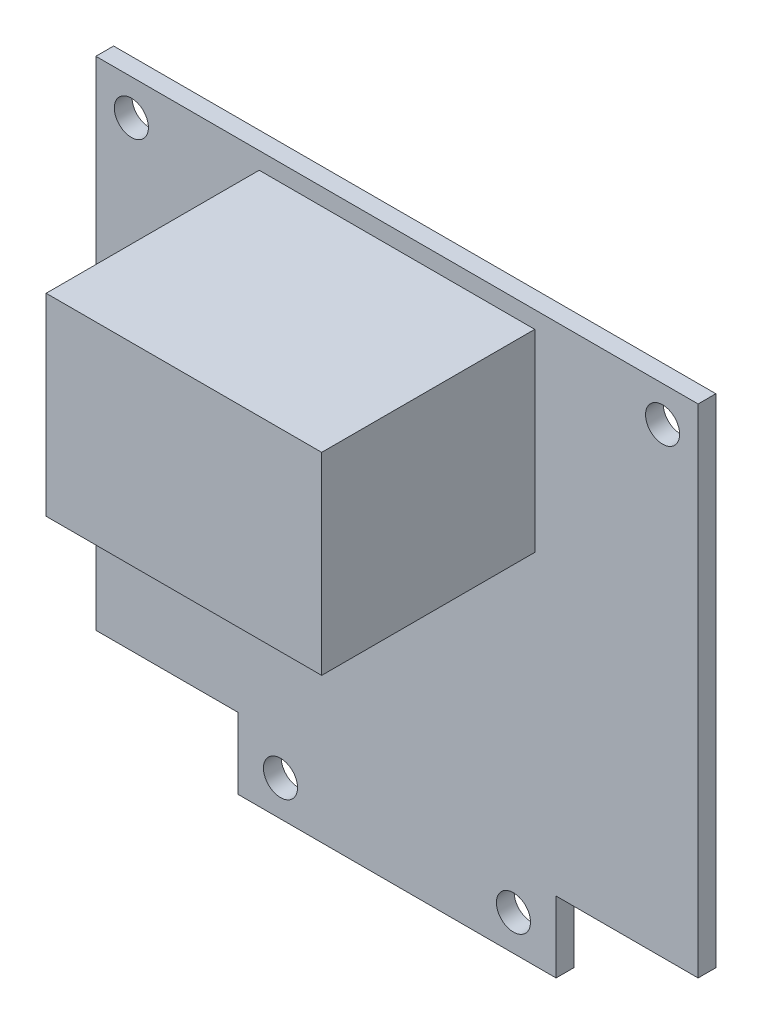
ISO-10303-21;
HEADER;
FILE_DESCRIPTION(('STEP AP214'),'2;1');
FILE_NAME('part.step','',(''),(''),'','','');
FILE_SCHEMA(('AUTOMOTIVE_DESIGN { 1 0 10303 214 1 1 1 1 }'));
ENDSEC;
DATA;
#1=APPLICATION_CONTEXT('core data for automotive mechanical design processes');
#2=APPLICATION_PROTOCOL_DEFINITION('international standard','automotive_design',2000,#1);
#3=PRODUCT_CONTEXT('',#1,'mechanical');
#4=PRODUCT('Part','Part','',(#3));
#5=PRODUCT_RELATED_PRODUCT_CATEGORY('part','',(#4));
#6=PRODUCT_DEFINITION_FORMATION('','',#4);
#7=PRODUCT_DEFINITION_CONTEXT('part definition',#1,'design');
#8=PRODUCT_DEFINITION('design','',#6,#7);
#9=PRODUCT_DEFINITION_SHAPE('','',#8);
#10=(LENGTH_UNIT() NAMED_UNIT(*) SI_UNIT(.MILLI.,.METRE.));
#11=(NAMED_UNIT(*) PLANE_ANGLE_UNIT() SI_UNIT($,.RADIAN.));
#12=(NAMED_UNIT(*) SI_UNIT($,.STERADIAN.) SOLID_ANGLE_UNIT());
#13=UNCERTAINTY_MEASURE_WITH_UNIT(LENGTH_MEASURE(1.E-05),#10,'distance_accuracy_value','');
#14=(GEOMETRIC_REPRESENTATION_CONTEXT(3) GLOBAL_UNCERTAINTY_ASSIGNED_CONTEXT((#13)) GLOBAL_UNIT_ASSIGNED_CONTEXT((#10,
#11,#12)) REPRESENTATION_CONTEXT('',''));
#15=CARTESIAN_POINT('',(0.,0.,0.));
#16=DIRECTION('',(0.,0.,1.));
#17=DIRECTION('',(1.,0.,0.));
#18=AXIS2_PLACEMENT_3D('',#15,#16,#17);
#19=CARTESIAN_POINT('',(0.,0.,1.5875));
#20=DIRECTION('',(0.,0.,1.));
#21=DIRECTION('',(1.,0.,0.));
#22=AXIS2_PLACEMENT_3D('',#19,#20,#21);
#23=PLANE('',#22);
#24=CARTESIAN_POINT('',(-10.414,-22.225,1.5875));
#25=DIRECTION('',(0.,0.,1.));
#26=DIRECTION('',(1.,0.,0.));
#27=AXIS2_PLACEMENT_3D('',#24,#25,#26);
#28=CIRCLE('',#27,1.524);
#29=CARTESIAN_POINT('',(-8.89,-22.225,1.5875));
#30=VERTEX_POINT('',#29);
#31=EDGE_CURVE('E181',#30,#30,#28,.T.);
#32=ORIENTED_EDGE('',*,*,#31,.F.);
#33=EDGE_LOOP('',(#32));
#34=FACE_BOUND('',#33,.T.);
#35=CARTESIAN_POINT('',(10.414,-22.225,1.5875));
#36=DIRECTION('',(0.,0.,1.));
#37=DIRECTION('',(1.,0.,0.));
#38=AXIS2_PLACEMENT_3D('',#35,#36,#37);
#39=CIRCLE('',#38,1.524);
#40=CARTESIAN_POINT('',(11.938,-22.225,1.5875));
#41=VERTEX_POINT('',#40);
#42=EDGE_CURVE('E394',#41,#41,#39,.T.);
#43=ORIENTED_EDGE('',*,*,#42,.F.);
#44=EDGE_LOOP('',(#43));
#45=FACE_BOUND('',#44,.T.);
#46=CARTESIAN_POINT('',(23.749,22.225,1.5875));
#47=DIRECTION('',(0.,0.,1.));
#48=DIRECTION('',(1.,0.,0.));
#49=AXIS2_PLACEMENT_3D('',#46,#47,#48);
#50=CIRCLE('',#49,1.524);
#51=CARTESIAN_POINT('',(25.273,22.225,1.5875));
#52=VERTEX_POINT('',#51);
#53=EDGE_CURVE('E397',#52,#52,#50,.T.);
#54=ORIENTED_EDGE('',*,*,#53,.F.);
#55=EDGE_LOOP('',(#54));
#56=FACE_BOUND('',#55,.T.);
#57=CARTESIAN_POINT('',(-23.749,22.225,1.5875));
#58=DIRECTION('',(0.,0.,1.));
#59=DIRECTION('',(1.,0.,0.));
#60=AXIS2_PLACEMENT_3D('',#57,#58,#59);
#61=CIRCLE('',#60,1.524);
#62=CARTESIAN_POINT('',(-22.225,22.225,1.5875));
#63=VERTEX_POINT('',#62);
#64=EDGE_CURVE('E400',#63,#63,#61,.T.);
#65=ORIENTED_EDGE('',*,*,#64,.F.);
#66=EDGE_LOOP('',(#65));
#67=FACE_BOUND('',#66,.T.);
#68=DIRECTION('',(0.,-1.,0.));
#69=VECTOR('',#68,1.);
#70=CARTESIAN_POINT('',(14.224,0.,1.5875));
#71=LINE('',#70,#69);
#72=CARTESIAN_POINT('',(14.224,-19.05,1.5875));
#73=VERTEX_POINT('',#72);
#74=CARTESIAN_POINT('',(14.224,-25.4,1.5875));
#75=VERTEX_POINT('',#74);
#76=EDGE_CURVE('E402',#73,#75,#71,.T.);
#77=ORIENTED_EDGE('',*,*,#76,.F.);
#78=DIRECTION('',(-1.,0.,0.));
#79=VECTOR('',#78,1.);
#80=CARTESIAN_POINT('',(0.,-19.05,1.5875));
#81=LINE('',#80,#79);
#82=CARTESIAN_POINT('',(26.924,-19.05,1.5875));
#83=VERTEX_POINT('',#82);
#84=EDGE_CURVE('E404',#83,#73,#81,.T.);
#85=ORIENTED_EDGE('',*,*,#84,.F.);
#86=DIRECTION('',(0.,1.,0.));
#87=VECTOR('',#86,1.);
#88=CARTESIAN_POINT('',(26.924,0.,1.5875));
#89=LINE('',#88,#87);
#90=CARTESIAN_POINT('',(26.924,25.4,1.5875));
#91=VERTEX_POINT('',#90);
#92=EDGE_CURVE('E153',#83,#91,#89,.T.);
#93=ORIENTED_EDGE('',*,*,#92,.T.);
#94=DIRECTION('',(1.,0.,0.));
#95=VECTOR('',#94,1.);
#96=CARTESIAN_POINT('',(0.,25.4,1.5875));
#97=LINE('',#96,#95);
#98=CARTESIAN_POINT('',(-26.924,25.4,1.5875));
#99=VERTEX_POINT('',#98);
#100=EDGE_CURVE('E407',#99,#91,#97,.T.);
#101=ORIENTED_EDGE('',*,*,#100,.F.);
#102=DIRECTION('',(0.,1.,0.));
#103=VECTOR('',#102,1.);
#104=CARTESIAN_POINT('',(-26.924,0.,1.5875));
#105=LINE('',#104,#103);
#106=CARTESIAN_POINT('',(-26.924,-19.05,1.5875));
#107=VERTEX_POINT('',#106);
#108=EDGE_CURVE('E130',#107,#99,#105,.T.);
#109=ORIENTED_EDGE('',*,*,#108,.F.);
#110=DIRECTION('',(1.,0.,0.));
#111=VECTOR('',#110,1.);
#112=CARTESIAN_POINT('',(0.,-19.05,1.5875));
#113=LINE('',#112,#111);
#114=CARTESIAN_POINT('',(-14.224,-19.05,1.5875));
#115=VERTEX_POINT('',#114);
#116=EDGE_CURVE('E123',#107,#115,#113,.T.);
#117=ORIENTED_EDGE('',*,*,#116,.T.);
#118=DIRECTION('',(0.,-1.,0.));
#119=VECTOR('',#118,1.);
#120=CARTESIAN_POINT('',(-14.224,0.,1.5875));
#121=LINE('',#120,#119);
#122=CARTESIAN_POINT('',(-14.224,-25.4,1.5875));
#123=VERTEX_POINT('',#122);
#124=EDGE_CURVE('E114',#115,#123,#121,.T.);
#125=ORIENTED_EDGE('',*,*,#124,.T.);
#126=DIRECTION('',(1.,0.,0.));
#127=VECTOR('',#126,1.);
#128=CARTESIAN_POINT('',(0.,-25.4,1.5875));
#129=LINE('',#128,#127);
#130=EDGE_CURVE('E59',#123,#75,#129,.T.);
#131=ORIENTED_EDGE('',*,*,#130,.T.);
#132=EDGE_LOOP('',(#77,#85,#93,#101,#109,#117,#125,#131));
#133=FACE_BOUND('',#132,.T.);
#134=DIRECTION('',(1.,0.,0.));
#135=VECTOR('',#134,1.);
#136=CARTESIAN_POINT('',(-12.319,6.604,1.5875));
#137=LINE('',#136,#135);
#138=CARTESIAN_POINT('',(-12.319,6.604,1.5875));
#139=VERTEX_POINT('',#138);
#140=CARTESIAN_POINT('',(12.319,6.604,1.5875));
#141=VERTEX_POINT('',#140);
#142=EDGE_CURVE('E430',#139,#141,#137,.T.);
#143=ORIENTED_EDGE('',*,*,#142,.F.);
#144=DIRECTION('',(0.,-1.,0.));
#145=VECTOR('',#144,1.);
#146=CARTESIAN_POINT('',(-12.319,23.876,1.5875));
#147=LINE('',#146,#145);
#148=CARTESIAN_POINT('',(-12.319,23.876,1.5875));
#149=VERTEX_POINT('',#148);
#150=EDGE_CURVE('E383',#149,#139,#147,.T.);
#151=ORIENTED_EDGE('',*,*,#150,.F.);
#152=DIRECTION('',(-1.,0.,0.));
#153=VECTOR('',#152,1.);
#154=CARTESIAN_POINT('',(-12.319,23.876,1.5875));
#155=LINE('',#154,#153);
#156=CARTESIAN_POINT('',(12.319,23.876,1.5875));
#157=VERTEX_POINT('',#156);
#158=EDGE_CURVE('E377',#157,#149,#155,.T.);
#159=ORIENTED_EDGE('',*,*,#158,.F.);
#160=DIRECTION('',(0.,1.,0.));
#161=VECTOR('',#160,1.);
#162=CARTESIAN_POINT('',(12.319,23.876,1.5875));
#163=LINE('',#162,#161);
#164=EDGE_CURVE('E428',#141,#157,#163,.T.);
#165=ORIENTED_EDGE('',*,*,#164,.F.);
#166=EDGE_LOOP('',(#143,#151,#159,#165));
#167=FACE_BOUND('',#166,.T.);
#168=ADVANCED_FACE('F35',(#34,#45,#56,#67,#133,#167),#23,.T.);
#169=CARTESIAN_POINT('',(14.224,0.,1.5875));
#170=DIRECTION('',(1.,0.,0.));
#171=DIRECTION('',(0.,0.,-1.));
#172=AXIS2_PLACEMENT_3D('',#169,#170,#171);
#173=PLANE('',#172);
#174=DIRECTION('',(0.,-1.,0.));
#175=VECTOR('',#174,1.);
#176=CARTESIAN_POINT('',(14.224,0.,0.));
#177=LINE('',#176,#175);
#178=CARTESIAN_POINT('',(14.224,-19.05,0.));
#179=VERTEX_POINT('',#178);
#180=CARTESIAN_POINT('',(14.224,-25.4,0.));
#181=VERTEX_POINT('',#180);
#182=EDGE_CURVE('E168',#179,#181,#177,.T.);
#183=ORIENTED_EDGE('',*,*,#182,.F.);
#184=DIRECTION('',(0.,0.,-1.));
#185=VECTOR('',#184,1.);
#186=CARTESIAN_POINT('',(14.224,-19.05,1.5875));
#187=LINE('',#186,#185);
#188=EDGE_CURVE('E11',#73,#179,#187,.T.);
#189=ORIENTED_EDGE('',*,*,#188,.F.);
#190=ORIENTED_EDGE('',*,*,#76,.T.);
#191=DIRECTION('',(0.,0.,-1.));
#192=VECTOR('',#191,1.);
#193=CARTESIAN_POINT('',(14.224,-25.4,1.5875));
#194=LINE('',#193,#192);
#195=EDGE_CURVE('E91',#75,#181,#194,.T.);
#196=ORIENTED_EDGE('',*,*,#195,.T.);
#197=EDGE_LOOP('',(#183,#189,#190,#196));
#198=FACE_BOUND('',#197,.T.);
#199=ADVANCED_FACE('F213',(#198),#173,.T.);
#200=CARTESIAN_POINT('',(0.,-19.05,1.5875));
#201=DIRECTION('',(0.,-1.,0.));
#202=DIRECTION('',(0.,0.,-1.));
#203=AXIS2_PLACEMENT_3D('',#200,#201,#202);
#204=PLANE('',#203);
#205=DIRECTION('',(-1.,0.,0.));
#206=VECTOR('',#205,1.);
#207=CARTESIAN_POINT('',(0.,-19.05,0.));
#208=LINE('',#207,#206);
#209=CARTESIAN_POINT('',(26.924,-19.05,0.));
#210=VERTEX_POINT('',#209);
#211=EDGE_CURVE('E162',#210,#179,#208,.T.);
#212=ORIENTED_EDGE('',*,*,#211,.F.);
#213=DIRECTION('',(0.,0.,-1.));
#214=VECTOR('',#213,1.);
#215=CARTESIAN_POINT('',(26.924,-19.05,1.5875));
#216=LINE('',#215,#214);
#217=EDGE_CURVE('E43',#83,#210,#216,.T.);
#218=ORIENTED_EDGE('',*,*,#217,.F.);
#219=ORIENTED_EDGE('',*,*,#84,.T.);
#220=ORIENTED_EDGE('',*,*,#188,.T.);
#221=EDGE_LOOP('',(#212,#218,#219,#220));
#222=FACE_BOUND('',#221,.T.);
#223=ADVANCED_FACE('F167',(#222),#204,.T.);
#224=CARTESIAN_POINT('',(26.924,0.,1.5875));
#225=DIRECTION('',(-1.,0.,0.));
#226=DIRECTION('',(0.,0.,1.));
#227=AXIS2_PLACEMENT_3D('',#224,#225,#226);
#228=PLANE('',#227);
#229=DIRECTION('',(0.,1.,0.));
#230=VECTOR('',#229,1.);
#231=CARTESIAN_POINT('',(26.924,0.,0.));
#232=LINE('',#231,#230);
#233=CARTESIAN_POINT('',(26.924,25.4,0.));
#234=VERTEX_POINT('',#233);
#235=EDGE_CURVE('E151',#210,#234,#232,.T.);
#236=ORIENTED_EDGE('',*,*,#235,.T.);
#237=DIRECTION('',(0.,0.,-1.));
#238=VECTOR('',#237,1.);
#239=CARTESIAN_POINT('',(26.924,25.4,1.5875));
#240=LINE('',#239,#238);
#241=EDGE_CURVE('E144',#91,#234,#240,.T.);
#242=ORIENTED_EDGE('',*,*,#241,.F.);
#243=ORIENTED_EDGE('',*,*,#92,.F.);
#244=ORIENTED_EDGE('',*,*,#217,.T.);
#245=EDGE_LOOP('',(#236,#242,#243,#244));
#246=FACE_BOUND('',#245,.T.);
#247=ADVANCED_FACE('F149',(#246),#228,.F.);
#248=CARTESIAN_POINT('',(0.,25.4,1.5875));
#249=DIRECTION('',(0.,1.,0.));
#250=DIRECTION('',(0.,0.,1.));
#251=AXIS2_PLACEMENT_3D('',#248,#249,#250);
#252=PLANE('',#251);
#253=DIRECTION('',(1.,0.,0.));
#254=VECTOR('',#253,1.);
#255=CARTESIAN_POINT('',(0.,25.4,0.));
#256=LINE('',#255,#254);
#257=CARTESIAN_POINT('',(-26.924,25.4,0.));
#258=VERTEX_POINT('',#257);
#259=EDGE_CURVE('E165',#258,#234,#256,.T.);
#260=ORIENTED_EDGE('',*,*,#259,.F.);
#261=DIRECTION('',(0.,0.,-1.));
#262=VECTOR('',#261,1.);
#263=CARTESIAN_POINT('',(-26.924,25.4,1.5875));
#264=LINE('',#263,#262);
#265=EDGE_CURVE('E138',#99,#258,#264,.T.);
#266=ORIENTED_EDGE('',*,*,#265,.F.);
#267=ORIENTED_EDGE('',*,*,#100,.T.);
#268=ORIENTED_EDGE('',*,*,#241,.T.);
#269=EDGE_LOOP('',(#260,#266,#267,#268));
#270=FACE_BOUND('',#269,.T.);
#271=ADVANCED_FACE('F237',(#270),#252,.T.);
#272=CARTESIAN_POINT('',(-26.924,0.,1.5875));
#273=DIRECTION('',(-1.,0.,0.));
#274=DIRECTION('',(0.,0.,1.));
#275=AXIS2_PLACEMENT_3D('',#272,#273,#274);
#276=PLANE('',#275);
#277=DIRECTION('',(0.,1.,0.));
#278=VECTOR('',#277,1.);
#279=CARTESIAN_POINT('',(-26.924,0.,0.));
#280=LINE('',#279,#278);
#281=CARTESIAN_POINT('',(-26.924,-19.05,0.));
#282=VERTEX_POINT('',#281);
#283=EDGE_CURVE('E175',#282,#258,#280,.T.);
#284=ORIENTED_EDGE('',*,*,#283,.F.);
#285=DIRECTION('',(0.,0.,-1.));
#286=VECTOR('',#285,1.);
#287=CARTESIAN_POINT('',(-26.924,-19.05,1.5875));
#288=LINE('',#287,#286);
#289=EDGE_CURVE('E136',#107,#282,#288,.T.);
#290=ORIENTED_EDGE('',*,*,#289,.F.);
#291=ORIENTED_EDGE('',*,*,#108,.T.);
#292=ORIENTED_EDGE('',*,*,#265,.T.);
#293=EDGE_LOOP('',(#284,#290,#291,#292));
#294=FACE_BOUND('',#293,.T.);
#295=ADVANCED_FACE('F234',(#294),#276,.T.);
#296=CARTESIAN_POINT('',(0.,-19.05,1.5875));
#297=DIRECTION('',(0.,1.,0.));
#298=DIRECTION('',(0.,0.,1.));
#299=AXIS2_PLACEMENT_3D('',#296,#297,#298);
#300=PLANE('',#299);
#301=DIRECTION('',(1.,0.,0.));
#302=VECTOR('',#301,1.);
#303=CARTESIAN_POINT('',(0.,-19.05,0.));
#304=LINE('',#303,#302);
#305=CARTESIAN_POINT('',(-14.224,-19.05,0.));
#306=VERTEX_POINT('',#305);
#307=EDGE_CURVE('E135',#282,#306,#304,.T.);
#308=ORIENTED_EDGE('',*,*,#307,.T.);
#309=DIRECTION('',(0.,0.,-1.));
#310=VECTOR('',#309,1.);
#311=CARTESIAN_POINT('',(-14.224,-19.05,1.5875));
#312=LINE('',#311,#310);
#313=EDGE_CURVE('E119',#115,#306,#312,.T.);
#314=ORIENTED_EDGE('',*,*,#313,.F.);
#315=ORIENTED_EDGE('',*,*,#116,.F.);
#316=ORIENTED_EDGE('',*,*,#289,.T.);
#317=EDGE_LOOP('',(#308,#314,#315,#316));
#318=FACE_BOUND('',#317,.T.);
#319=ADVANCED_FACE('F133',(#318),#300,.F.);
#320=CARTESIAN_POINT('',(-14.224,0.,1.5875));
#321=DIRECTION('',(1.,0.,0.));
#322=DIRECTION('',(0.,0.,-1.));
#323=AXIS2_PLACEMENT_3D('',#320,#321,#322);
#324=PLANE('',#323);
#325=DIRECTION('',(0.,-1.,0.));
#326=VECTOR('',#325,1.);
#327=CARTESIAN_POINT('',(-14.224,0.,0.));
#328=LINE('',#327,#326);
#329=CARTESIAN_POINT('',(-14.224,-25.4,0.));
#330=VERTEX_POINT('',#329);
#331=EDGE_CURVE('E178',#306,#330,#328,.T.);
#332=ORIENTED_EDGE('',*,*,#331,.T.);
#333=DIRECTION('',(0.,0.,-1.));
#334=VECTOR('',#333,1.);
#335=CARTESIAN_POINT('',(-14.224,-25.4,1.5875));
#336=LINE('',#335,#334);
#337=EDGE_CURVE('E122',#123,#330,#336,.T.);
#338=ORIENTED_EDGE('',*,*,#337,.F.);
#339=ORIENTED_EDGE('',*,*,#124,.F.);
#340=ORIENTED_EDGE('',*,*,#313,.T.);
#341=EDGE_LOOP('',(#332,#338,#339,#340));
#342=FACE_BOUND('',#341,.T.);
#343=ADVANCED_FACE('F117',(#342),#324,.F.);
#344=CARTESIAN_POINT('',(-23.749,22.225,1.5875));
#345=DIRECTION('',(0.,0.,-1.));
#346=DIRECTION('',(-1.,0.,0.));
#347=AXIS2_PLACEMENT_3D('',#344,#345,#346);
#348=CYLINDRICAL_SURFACE('',#347,1.524);
#349=ORIENTED_EDGE('',*,*,#64,.T.);
#350=EDGE_LOOP('',(#349));
#351=FACE_BOUND('',#350,.T.);
#352=CARTESIAN_POINT('',(-23.749,22.225,0.));
#353=DIRECTION('',(0.,0.,1.));
#354=DIRECTION('',(1.,0.,0.));
#355=AXIS2_PLACEMENT_3D('',#352,#353,#354);
#356=CIRCLE('',#355,1.524);
#357=CARTESIAN_POINT('',(-22.225,22.225,0.));
#358=VERTEX_POINT('',#357);
#359=EDGE_CURVE('E170',#358,#358,#356,.T.);
#360=ORIENTED_EDGE('',*,*,#359,.F.);
#361=EDGE_LOOP('',(#360));
#362=FACE_BOUND('',#361,.T.);
#363=ADVANCED_FACE('F197',(#351,#362),#348,.F.);
#364=CARTESIAN_POINT('',(23.749,22.225,1.5875));
#365=DIRECTION('',(0.,0.,-1.));
#366=DIRECTION('',(-1.,0.,0.));
#367=AXIS2_PLACEMENT_3D('',#364,#365,#366);
#368=CYLINDRICAL_SURFACE('',#367,1.524);
#369=ORIENTED_EDGE('',*,*,#53,.T.);
#370=EDGE_LOOP('',(#369));
#371=FACE_BOUND('',#370,.T.);
#372=CARTESIAN_POINT('',(23.749,22.225,0.));
#373=DIRECTION('',(0.,0.,1.));
#374=DIRECTION('',(1.,0.,0.));
#375=AXIS2_PLACEMENT_3D('',#372,#373,#374);
#376=CIRCLE('',#375,1.524);
#377=CARTESIAN_POINT('',(25.273,22.225,0.));
#378=VERTEX_POINT('',#377);
#379=EDGE_CURVE('E191',#378,#378,#376,.T.);
#380=ORIENTED_EDGE('',*,*,#379,.F.);
#381=EDGE_LOOP('',(#380));
#382=FACE_BOUND('',#381,.T.);
#383=ADVANCED_FACE('F199',(#371,#382),#368,.F.);
#384=CARTESIAN_POINT('',(10.414,-22.225,1.5875));
#385=DIRECTION('',(0.,0.,-1.));
#386=DIRECTION('',(-1.,0.,0.));
#387=AXIS2_PLACEMENT_3D('',#384,#385,#386);
#388=CYLINDRICAL_SURFACE('',#387,1.524);
#389=ORIENTED_EDGE('',*,*,#42,.T.);
#390=EDGE_LOOP('',(#389));
#391=FACE_BOUND('',#390,.T.);
#392=CARTESIAN_POINT('',(10.414,-22.225,0.));
#393=DIRECTION('',(0.,0.,1.));
#394=DIRECTION('',(1.,0.,0.));
#395=AXIS2_PLACEMENT_3D('',#392,#393,#394);
#396=CIRCLE('',#395,1.524);
#397=CARTESIAN_POINT('',(11.938,-22.225,0.));
#398=VERTEX_POINT('',#397);
#399=EDGE_CURVE('E187',#398,#398,#396,.T.);
#400=ORIENTED_EDGE('',*,*,#399,.F.);
#401=EDGE_LOOP('',(#400));
#402=FACE_BOUND('',#401,.T.);
#403=ADVANCED_FACE('F206',(#391,#402),#388,.F.);
#404=CARTESIAN_POINT('',(-10.414,-22.225,1.5875));
#405=DIRECTION('',(0.,0.,-1.));
#406=DIRECTION('',(-1.,0.,0.));
#407=AXIS2_PLACEMENT_3D('',#404,#405,#406);
#408=CYLINDRICAL_SURFACE('',#407,1.524);
#409=ORIENTED_EDGE('',*,*,#31,.T.);
#410=EDGE_LOOP('',(#409));
#411=FACE_BOUND('',#410,.T.);
#412=CARTESIAN_POINT('',(-10.414,-22.225,0.));
#413=DIRECTION('',(0.,0.,1.));
#414=DIRECTION('',(1.,0.,0.));
#415=AXIS2_PLACEMENT_3D('',#412,#413,#414);
#416=CIRCLE('',#415,1.524);
#417=CARTESIAN_POINT('',(-8.89,-22.225,0.));
#418=VERTEX_POINT('',#417);
#419=EDGE_CURVE('E184',#418,#418,#416,.T.);
#420=ORIENTED_EDGE('',*,*,#419,.F.);
#421=EDGE_LOOP('',(#420));
#422=FACE_BOUND('',#421,.T.);
#423=ADVANCED_FACE('F37',(#411,#422),#408,.F.);
#424=CARTESIAN_POINT('',(0.,-25.4,1.5875));
#425=DIRECTION('',(0.,1.,0.));
#426=DIRECTION('',(0.,0.,1.));
#427=AXIS2_PLACEMENT_3D('',#424,#425,#426);
#428=PLANE('',#427);
#429=DIRECTION('',(1.,0.,0.));
#430=VECTOR('',#429,1.);
#431=CARTESIAN_POINT('',(0.,-25.4,0.));
#432=LINE('',#431,#430);
#433=EDGE_CURVE('E180',#330,#181,#432,.T.);
#434=ORIENTED_EDGE('',*,*,#433,.T.);
#435=ORIENTED_EDGE('',*,*,#195,.F.);
#436=ORIENTED_EDGE('',*,*,#130,.F.);
#437=ORIENTED_EDGE('',*,*,#337,.T.);
#438=EDGE_LOOP('',(#434,#435,#436,#437));
#439=FACE_BOUND('',#438,.T.);
#440=ADVANCED_FACE('F227',(#439),#428,.F.);
#441=CARTESIAN_POINT('',(0.,0.,0.));
#442=DIRECTION('',(0.,0.,1.));
#443=DIRECTION('',(1.,0.,0.));
#444=AXIS2_PLACEMENT_3D('',#441,#442,#443);
#445=PLANE('',#444);
#446=ORIENTED_EDGE('',*,*,#419,.T.);
#447=EDGE_LOOP('',(#446));
#448=FACE_BOUND('',#447,.T.);
#449=ORIENTED_EDGE('',*,*,#399,.T.);
#450=EDGE_LOOP('',(#449));
#451=FACE_BOUND('',#450,.T.);
#452=ORIENTED_EDGE('',*,*,#379,.T.);
#453=EDGE_LOOP('',(#452));
#454=FACE_BOUND('',#453,.T.);
#455=ORIENTED_EDGE('',*,*,#359,.T.);
#456=EDGE_LOOP('',(#455));
#457=FACE_BOUND('',#456,.T.);
#458=ORIENTED_EDGE('',*,*,#182,.T.);
#459=ORIENTED_EDGE('',*,*,#433,.F.);
#460=ORIENTED_EDGE('',*,*,#331,.F.);
#461=ORIENTED_EDGE('',*,*,#307,.F.);
#462=ORIENTED_EDGE('',*,*,#283,.T.);
#463=ORIENTED_EDGE('',*,*,#259,.T.);
#464=ORIENTED_EDGE('',*,*,#235,.F.);
#465=ORIENTED_EDGE('',*,*,#211,.T.);
#466=EDGE_LOOP('',(#458,#459,#460,#461,#462,#463,#464,#465));
#467=FACE_BOUND('',#466,.T.);
#468=ADVANCED_FACE('F161',(#448,#451,#454,#457,#467),#445,.F.);
#469=CARTESIAN_POINT('',(-12.319,23.876,20.6375));
#470=DIRECTION('',(1.,0.,0.));
#471=DIRECTION('',(0.,1.,0.));
#472=AXIS2_PLACEMENT_3D('',#469,#470,#471);
#473=PLANE('',#472);
#474=ORIENTED_EDGE('',*,*,#150,.T.);
#475=DIRECTION('',(0.,0.,-1.));
#476=VECTOR('',#475,1.);
#477=CARTESIAN_POINT('',(-12.319,6.604,20.6375));
#478=LINE('',#477,#476);
#479=CARTESIAN_POINT('',(-12.319,6.604,20.6375));
#480=VERTEX_POINT('',#479);
#481=EDGE_CURVE('E188',#480,#139,#478,.T.);
#482=ORIENTED_EDGE('',*,*,#481,.F.);
#483=DIRECTION('',(0.,-1.,0.));
#484=VECTOR('',#483,1.);
#485=CARTESIAN_POINT('',(-12.319,23.876,20.6375));
#486=LINE('',#485,#484);
#487=CARTESIAN_POINT('',(-12.319,23.876,20.6375));
#488=VERTEX_POINT('',#487);
#489=EDGE_CURVE('E366',#488,#480,#486,.T.);
#490=ORIENTED_EDGE('',*,*,#489,.F.);
#491=DIRECTION('',(0.,0.,-1.));
#492=VECTOR('',#491,1.);
#493=CARTESIAN_POINT('',(-12.319,23.876,20.6375));
#494=LINE('',#493,#492);
#495=EDGE_CURVE('E425',#488,#149,#494,.T.);
#496=ORIENTED_EDGE('',*,*,#495,.T.);
#497=EDGE_LOOP('',(#474,#482,#490,#496));
#498=FACE_BOUND('',#497,.T.);
#499=ADVANCED_FACE('F223',(#498),#473,.F.);
#500=CARTESIAN_POINT('',(-12.319,6.604,20.6375));
#501=DIRECTION('',(0.,1.,0.));
#502=DIRECTION('',(0.,0.,1.));
#503=AXIS2_PLACEMENT_3D('',#500,#501,#502);
#504=PLANE('',#503);
#505=ORIENTED_EDGE('',*,*,#142,.T.);
#506=DIRECTION('',(0.,0.,-1.));
#507=VECTOR('',#506,1.);
#508=CARTESIAN_POINT('',(12.319,6.604,20.6375));
#509=LINE('',#508,#507);
#510=CARTESIAN_POINT('',(12.319,6.604,20.6375));
#511=VERTEX_POINT('',#510);
#512=EDGE_CURVE('E386',#511,#141,#509,.T.);
#513=ORIENTED_EDGE('',*,*,#512,.F.);
#514=DIRECTION('',(1.,0.,0.));
#515=VECTOR('',#514,1.);
#516=CARTESIAN_POINT('',(-12.319,6.604,20.6375));
#517=LINE('',#516,#515);
#518=EDGE_CURVE('E371',#480,#511,#517,.T.);
#519=ORIENTED_EDGE('',*,*,#518,.F.);
#520=ORIENTED_EDGE('',*,*,#481,.T.);
#521=EDGE_LOOP('',(#505,#513,#519,#520));
#522=FACE_BOUND('',#521,.T.);
#523=ADVANCED_FACE('F320',(#522),#504,.F.);
#524=CARTESIAN_POINT('',(12.319,23.876,20.6375));
#525=DIRECTION('',(-1.,0.,0.));
#526=DIRECTION('',(0.,-1.,0.));
#527=AXIS2_PLACEMENT_3D('',#524,#525,#526);
#528=PLANE('',#527);
#529=ORIENTED_EDGE('',*,*,#164,.T.);
#530=DIRECTION('',(0.,0.,-1.));
#531=VECTOR('',#530,1.);
#532=CARTESIAN_POINT('',(12.319,23.876,20.6375));
#533=LINE('',#532,#531);
#534=CARTESIAN_POINT('',(12.319,23.876,20.6375));
#535=VERTEX_POINT('',#534);
#536=EDGE_CURVE('E50',#535,#157,#533,.T.);
#537=ORIENTED_EDGE('',*,*,#536,.F.);
#538=DIRECTION('',(0.,1.,0.));
#539=VECTOR('',#538,1.);
#540=CARTESIAN_POINT('',(12.319,23.876,20.6375));
#541=LINE('',#540,#539);
#542=EDGE_CURVE('E434',#511,#535,#541,.T.);
#543=ORIENTED_EDGE('',*,*,#542,.F.);
#544=ORIENTED_EDGE('',*,*,#512,.T.);
#545=EDGE_LOOP('',(#529,#537,#543,#544));
#546=FACE_BOUND('',#545,.T.);
#547=ADVANCED_FACE('F329',(#546),#528,.F.);
#548=CARTESIAN_POINT('',(-12.319,23.876,20.6375));
#549=DIRECTION('',(0.,-1.,0.));
#550=DIRECTION('',(1.,0.,0.));
#551=AXIS2_PLACEMENT_3D('',#548,#549,#550);
#552=PLANE('',#551);
#553=ORIENTED_EDGE('',*,*,#158,.T.);
#554=ORIENTED_EDGE('',*,*,#495,.F.);
#555=DIRECTION('',(-1.,0.,0.));
#556=VECTOR('',#555,1.);
#557=CARTESIAN_POINT('',(-12.319,23.876,20.6375));
#558=LINE('',#557,#556);
#559=EDGE_CURVE('E373',#535,#488,#558,.T.);
#560=ORIENTED_EDGE('',*,*,#559,.F.);
#561=ORIENTED_EDGE('',*,*,#536,.T.);
#562=EDGE_LOOP('',(#553,#554,#560,#561));
#563=FACE_BOUND('',#562,.T.);
#564=ADVANCED_FACE('F338',(#563),#552,.F.);
#565=CARTESIAN_POINT('',(0.,0.,20.6375));
#566=DIRECTION('',(0.,0.,1.));
#567=DIRECTION('',(1.,0.,0.));
#568=AXIS2_PLACEMENT_3D('',#565,#566,#567);
#569=PLANE('',#568);
#570=ORIENTED_EDGE('',*,*,#489,.T.);
#571=ORIENTED_EDGE('',*,*,#518,.T.);
#572=ORIENTED_EDGE('',*,*,#542,.T.);
#573=ORIENTED_EDGE('',*,*,#559,.T.);
#574=EDGE_LOOP('',(#570,#571,#572,#573));
#575=FACE_BOUND('',#574,.T.);
#576=ADVANCED_FACE('F348',(#575),#569,.T.);
#577=CLOSED_SHELL('',(#168,#199,#223,#247,#271,#295,#319,#343,#363,#383,#403,#423,#440,#468,
#499,#523,#547,#564,#576));
#578=MANIFOLD_SOLID_BREP('B2',#577);
#579=ADVANCED_BREP_SHAPE_REPRESENTATION('',(#18,#578),#14);
#580=SHAPE_DEFINITION_REPRESENTATION(#9,#579);
ENDSEC;
END-ISO-10303-21;
